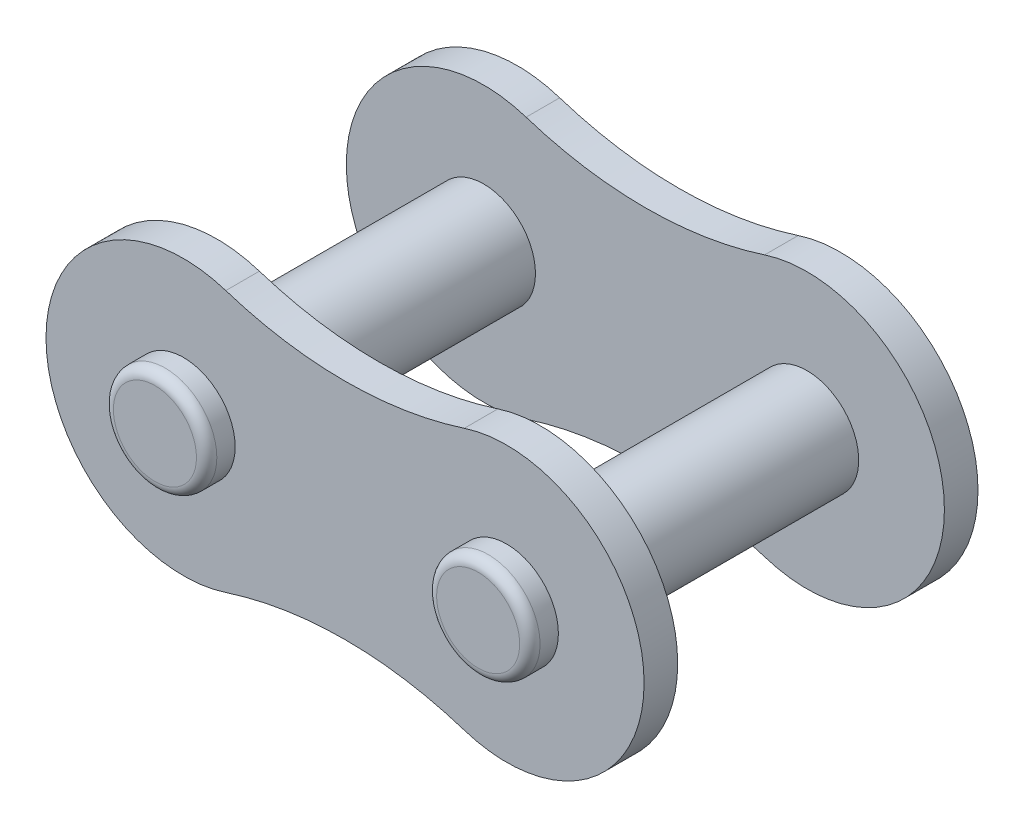
ISO-10303-21;
HEADER;
FILE_DESCRIPTION(('STEP AP214'),'2;1');
FILE_NAME('part.step','',(''),(''),'','','');
FILE_SCHEMA(('AUTOMOTIVE_DESIGN { 1 0 10303 214 1 1 1 1 }'));
ENDSEC;
DATA;
#1=APPLICATION_CONTEXT('core data for automotive mechanical design processes');
#2=APPLICATION_PROTOCOL_DEFINITION('international standard','automotive_design',2000,#1);
#3=PRODUCT_CONTEXT('',#1,'mechanical');
#4=PRODUCT('Part','Part','',(#3));
#5=PRODUCT_RELATED_PRODUCT_CATEGORY('part','',(#4));
#6=PRODUCT_DEFINITION_FORMATION('','',#4);
#7=PRODUCT_DEFINITION_CONTEXT('part definition',#1,'design');
#8=PRODUCT_DEFINITION('design','',#6,#7);
#9=PRODUCT_DEFINITION_SHAPE('','',#8);
#10=(LENGTH_UNIT() NAMED_UNIT(*) SI_UNIT(.MILLI.,.METRE.));
#11=(NAMED_UNIT(*) PLANE_ANGLE_UNIT() SI_UNIT($,.RADIAN.));
#12=(NAMED_UNIT(*) SI_UNIT($,.STERADIAN.) SOLID_ANGLE_UNIT());
#13=UNCERTAINTY_MEASURE_WITH_UNIT(LENGTH_MEASURE(1.E-05),#10,'distance_accuracy_value','');
#14=(GEOMETRIC_REPRESENTATION_CONTEXT(3) GLOBAL_UNCERTAINTY_ASSIGNED_CONTEXT((#13)) GLOBAL_UNIT_ASSIGNED_CONTEXT((#10,
#11,#12)) REPRESENTATION_CONTEXT('',''));
#15=CARTESIAN_POINT('',(0.,0.,0.));
#16=DIRECTION('',(0.,0.,1.));
#17=DIRECTION('',(1.,0.,0.));
#18=AXIS2_PLACEMENT_3D('',#15,#16,#17);
#19=CARTESIAN_POINT('',(0.,0.,-10.56));
#20=DIRECTION('',(0.,0.,-1.));
#21=DIRECTION('',(-1.,0.,0.));
#22=AXIS2_PLACEMENT_3D('',#19,#20,#21);
#23=CYLINDRICAL_SURFACE('',#22,2.54);
#24=CARTESIAN_POINT('',(0.,0.,-6.55));
#25=DIRECTION('',(0.,0.,-1.));
#26=DIRECTION('',(-1.,0.,0.));
#27=AXIS2_PLACEMENT_3D('',#24,#25,#26);
#28=CIRCLE('',#27,2.54);
#29=CARTESIAN_POINT('',(-2.54,0.,-6.55));
#30=VERTEX_POINT('',#29);
#31=EDGE_CURVE('E198',#30,#30,#28,.T.);
#32=ORIENTED_EDGE('',*,*,#31,.F.);
#33=EDGE_LOOP('',(#32));
#34=FACE_BOUND('',#33,.T.);
#35=CARTESIAN_POINT('',(0.,0.,6.55));
#36=DIRECTION('',(0.,0.,1.));
#37=DIRECTION('',(1.,0.,0.));
#38=AXIS2_PLACEMENT_3D('',#35,#36,#37);
#39=CIRCLE('',#38,2.54);
#40=CARTESIAN_POINT('',(2.54,0.,6.55));
#41=VERTEX_POINT('',#40);
#42=EDGE_CURVE('E11',#41,#41,#39,.T.);
#43=ORIENTED_EDGE('',*,*,#42,.F.);
#44=EDGE_LOOP('',(#43));
#45=FACE_BOUND('',#44,.T.);
#46=ADVANCED_FACE('F32',(#34,#45),#23,.T.);
#47=CARTESIAN_POINT('',(-15.875,0.,9.6));
#48=DIRECTION('',(0.,0.,1.));
#49=DIRECTION('',(1.,0.,0.));
#50=AXIS2_PLACEMENT_3D('',#47,#48,#49);
#51=CYLINDRICAL_SURFACE('',#50,2.54);
#52=CARTESIAN_POINT('',(-15.875,0.,-6.55));
#53=DIRECTION('',(0.,0.,-1.));
#54=DIRECTION('',(-1.,0.,0.));
#55=AXIS2_PLACEMENT_3D('',#52,#53,#54);
#56=CIRCLE('',#55,2.54);
#57=CARTESIAN_POINT('',(-18.415,0.,-6.55));
#58=VERTEX_POINT('',#57);
#59=EDGE_CURVE('E156',#58,#58,#56,.T.);
#60=ORIENTED_EDGE('',*,*,#59,.F.);
#61=EDGE_LOOP('',(#60));
#62=FACE_BOUND('',#61,.T.);
#63=CARTESIAN_POINT('',(-15.875,0.,6.55));
#64=DIRECTION('',(0.,0.,1.));
#65=DIRECTION('',(1.,0.,0.));
#66=AXIS2_PLACEMENT_3D('',#63,#64,#65);
#67=CIRCLE('',#66,2.54);
#68=CARTESIAN_POINT('',(-13.335,0.,6.55));
#69=VERTEX_POINT('',#68);
#70=EDGE_CURVE('E135',#69,#69,#67,.F.);
#71=ORIENTED_EDGE('',*,*,#70,.T.);
#72=EDGE_LOOP('',(#71));
#73=FACE_BOUND('',#72,.T.);
#74=ADVANCED_FACE('F203',(#62,#73),#51,.T.);
#75=CARTESIAN_POINT('',(0.,0.,-8.2));
#76=DIRECTION('',(0.,0.,-1.));
#77=DIRECTION('',(-1.,0.,0.));
#78=AXIS2_PLACEMENT_3D('',#75,#76,#77);
#79=CIRCLE('',#78,2.54);
#80=CARTESIAN_POINT('',(-2.54,0.,-8.2));
#81=VERTEX_POINT('',#80);
#82=EDGE_CURVE('E162',#81,#81,#79,.T.);
#83=ORIENTED_EDGE('',*,*,#82,.T.);
#84=EDGE_LOOP('',(#83));
#85=FACE_BOUND('',#84,.T.);
#86=CARTESIAN_POINT('',(0.,0.,-9.1));
#87=DIRECTION('',(0.,0.,-1.));
#88=DIRECTION('',(-1.,0.,0.));
#89=AXIS2_PLACEMENT_3D('',#86,#87,#88);
#90=CIRCLE('',#89,2.54);
#91=CARTESIAN_POINT('',(-2.54,0.,-9.1));
#92=VERTEX_POINT('',#91);
#93=EDGE_CURVE('E192',#92,#92,#90,.T.);
#94=ORIENTED_EDGE('',*,*,#93,.F.);
#95=EDGE_LOOP('',(#94));
#96=FACE_BOUND('',#95,.T.);
#97=ADVANCED_FACE('F213',(#85,#96),#23,.T.);
#98=CARTESIAN_POINT('',(0.,0.,-9.1));
#99=DIRECTION('',(0.,0.,-1.));
#100=DIRECTION('',(-1.,0.,0.));
#101=AXIS2_PLACEMENT_3D('',#98,#99,#100);
#102=TOROIDAL_SURFACE('',#101,2.04,0.500000000000001);
#103=CARTESIAN_POINT('',(0.,0.,-9.6));
#104=DIRECTION('',(0.,0.,-1.));
#105=DIRECTION('',(-1.,0.,0.));
#106=AXIS2_PLACEMENT_3D('',#103,#104,#105);
#107=CIRCLE('',#106,2.04);
#108=CARTESIAN_POINT('',(-2.04,0.,-9.6));
#109=VERTEX_POINT('',#108);
#110=EDGE_CURVE('E189',#109,#109,#107,.T.);
#111=ORIENTED_EDGE('',*,*,#110,.F.);
#112=EDGE_LOOP('',(#111));
#113=FACE_BOUND('',#112,.T.);
#114=ORIENTED_EDGE('',*,*,#93,.T.);
#115=EDGE_LOOP('',(#114));
#116=FACE_BOUND('',#115,.T.);
#117=ADVANCED_FACE('F226',(#113,#116),#102,.T.);
#118=CARTESIAN_POINT('',(0.,0.,-9.6));
#119=DIRECTION('',(0.,0.,1.));
#120=DIRECTION('',(1.,0.,0.));
#121=AXIS2_PLACEMENT_3D('',#118,#119,#120);
#122=PLANE('',#121);
#123=ORIENTED_EDGE('',*,*,#110,.T.);
#124=EDGE_LOOP('',(#123));
#125=FACE_BOUND('',#124,.T.);
#126=ADVANCED_FACE('F231',(#125),#122,.F.);
#127=CARTESIAN_POINT('',(-3.96875,-12.2480467192732,-8.2));
#128=DIRECTION('',(0.,0.,-1.));
#129=DIRECTION('',(-1.,0.,0.));
#130=AXIS2_PLACEMENT_3D('',#127,#128,#129);
#131=PLANE('',#130);
#132=ORIENTED_EDGE('',*,*,#82,.F.);
#133=EDGE_LOOP('',(#132));
#134=FACE_BOUND('',#133,.T.);
#135=CARTESIAN_POINT('',(-7.9375,-24.4960934385465,-8.2));
#136=DIRECTION('',(0.,0.,1.));
#137=DIRECTION('',(-1.,0.,0.));
#138=AXIS2_PLACEMENT_3D('',#135,#136,#137);
#139=CIRCLE('',#138,19.);
#140=CARTESIAN_POINT('',(-2.08070388349515,-6.42130604699762,-8.2));
#141=VERTEX_POINT('',#140);
#142=CARTESIAN_POINT('',(-13.7942961165049,-6.42130604699762,-8.2));
#143=VERTEX_POINT('',#142);
#144=EDGE_CURVE('E166',#141,#143,#139,.T.);
#145=ORIENTED_EDGE('',*,*,#144,.T.);
#146=CARTESIAN_POINT('',(-15.875,0.,-8.2));
#147=DIRECTION('',(0.,0.,-1.));
#148=DIRECTION('',(-1.,0.,0.));
#149=AXIS2_PLACEMENT_3D('',#146,#147,#148);
#150=CIRCLE('',#149,6.75);
#151=CARTESIAN_POINT('',(-13.7942961165049,6.42130604699762,-8.2));
#152=VERTEX_POINT('',#151);
#153=EDGE_CURVE('E82',#143,#152,#150,.T.);
#154=ORIENTED_EDGE('',*,*,#153,.T.);
#155=CARTESIAN_POINT('',(-7.9375,24.4960934385465,-8.2));
#156=DIRECTION('',(0.,0.,1.));
#157=DIRECTION('',(1.,0.,0.));
#158=AXIS2_PLACEMENT_3D('',#155,#156,#157);
#159=CIRCLE('',#158,19.);
#160=CARTESIAN_POINT('',(-2.08070388349515,6.42130604699762,-8.2));
#161=VERTEX_POINT('',#160);
#162=EDGE_CURVE('E169',#152,#161,#159,.T.);
#163=ORIENTED_EDGE('',*,*,#162,.T.);
#164=CARTESIAN_POINT('',(0.,0.,-8.2));
#165=DIRECTION('',(0.,0.,-1.));
#166=DIRECTION('',(-1.,0.,0.));
#167=AXIS2_PLACEMENT_3D('',#164,#165,#166);
#168=CIRCLE('',#167,6.75);
#169=EDGE_CURVE('E50',#161,#141,#168,.T.);
#170=ORIENTED_EDGE('',*,*,#169,.T.);
#171=EDGE_LOOP('',(#145,#154,#163,#170));
#172=FACE_BOUND('',#171,.T.);
#173=CARTESIAN_POINT('',(-15.875,0.,-8.2));
#174=DIRECTION('',(0.,0.,-1.));
#175=DIRECTION('',(-1.,0.,0.));
#176=AXIS2_PLACEMENT_3D('',#173,#174,#175);
#177=CIRCLE('',#176,2.54);
#178=CARTESIAN_POINT('',(-18.415,0.,-8.2));
#179=VERTEX_POINT('',#178);
#180=EDGE_CURVE('E159',#179,#179,#177,.T.);
#181=ORIENTED_EDGE('',*,*,#180,.F.);
#182=EDGE_LOOP('',(#181));
#183=FACE_BOUND('',#182,.T.);
#184=ADVANCED_FACE('F238',(#134,#172,#183),#131,.T.);
#185=CARTESIAN_POINT('',(-3.96875,-12.2480467192732,-6.55));
#186=DIRECTION('',(0.,0.,-1.));
#187=DIRECTION('',(-1.,0.,0.));
#188=AXIS2_PLACEMENT_3D('',#185,#186,#187);
#189=PLANE('',#188);
#190=CARTESIAN_POINT('',(-7.9375,-24.4960934385465,-6.55));
#191=DIRECTION('',(0.,0.,1.));
#192=DIRECTION('',(-1.,0.,0.));
#193=AXIS2_PLACEMENT_3D('',#190,#191,#192);
#194=CIRCLE('',#193,19.);
#195=CARTESIAN_POINT('',(-2.08070388349515,-6.42130604699762,-6.55));
#196=VERTEX_POINT('',#195);
#197=CARTESIAN_POINT('',(-13.7942961165049,-6.42130604699762,-6.55));
#198=VERTEX_POINT('',#197);
#199=EDGE_CURVE('E165',#196,#198,#194,.T.);
#200=ORIENTED_EDGE('',*,*,#199,.F.);
#201=CARTESIAN_POINT('',(0.,0.,-6.55));
#202=DIRECTION('',(0.,0.,-1.));
#203=DIRECTION('',(-1.,0.,0.));
#204=AXIS2_PLACEMENT_3D('',#201,#202,#203);
#205=CIRCLE('',#204,6.75);
#206=CARTESIAN_POINT('',(-2.08070388349515,6.42130604699762,-6.55));
#207=VERTEX_POINT('',#206);
#208=EDGE_CURVE('E74',#207,#196,#205,.T.);
#209=ORIENTED_EDGE('',*,*,#208,.F.);
#210=CARTESIAN_POINT('',(-7.9375,24.4960934385465,-6.55));
#211=DIRECTION('',(0.,0.,1.));
#212=DIRECTION('',(1.,0.,0.));
#213=AXIS2_PLACEMENT_3D('',#210,#211,#212);
#214=CIRCLE('',#213,19.);
#215=CARTESIAN_POINT('',(-13.7942961165049,6.42130604699762,-6.55));
#216=VERTEX_POINT('',#215);
#217=EDGE_CURVE('E68',#216,#207,#214,.T.);
#218=ORIENTED_EDGE('',*,*,#217,.F.);
#219=CARTESIAN_POINT('',(-15.875,0.,-6.55));
#220=DIRECTION('',(0.,0.,-1.));
#221=DIRECTION('',(-1.,0.,0.));
#222=AXIS2_PLACEMENT_3D('',#219,#220,#221);
#223=CIRCLE('',#222,6.75);
#224=EDGE_CURVE('E175',#198,#216,#223,.T.);
#225=ORIENTED_EDGE('',*,*,#224,.F.);
#226=EDGE_LOOP('',(#200,#209,#218,#225));
#227=FACE_BOUND('',#226,.T.);
#228=ORIENTED_EDGE('',*,*,#31,.T.);
#229=EDGE_LOOP('',(#228));
#230=FACE_BOUND('',#229,.T.);
#231=ORIENTED_EDGE('',*,*,#59,.T.);
#232=EDGE_LOOP('',(#231));
#233=FACE_BOUND('',#232,.T.);
#234=ADVANCED_FACE('F240',(#227,#230,#233),#189,.F.);
#235=CARTESIAN_POINT('',(-7.9375,-24.4960934385465,-8.2));
#236=DIRECTION('',(0.,0.,1.));
#237=DIRECTION('',(1.,0.,0.));
#238=AXIS2_PLACEMENT_3D('',#235,#236,#237);
#239=CYLINDRICAL_SURFACE('',#238,19.);
#240=ORIENTED_EDGE('',*,*,#199,.T.);
#241=DIRECTION('',(0.,0.,1.));
#242=VECTOR('',#241,1.);
#243=CARTESIAN_POINT('',(-13.7942961165049,-6.42130604699762,-8.2));
#244=LINE('',#243,#242);
#245=EDGE_CURVE('E184',#143,#198,#244,.T.);
#246=ORIENTED_EDGE('',*,*,#245,.F.);
#247=ORIENTED_EDGE('',*,*,#144,.F.);
#248=DIRECTION('',(0.,0.,1.));
#249=VECTOR('',#248,1.);
#250=CARTESIAN_POINT('',(-2.08070388349515,-6.42130604699762,-8.2));
#251=LINE('',#250,#249);
#252=EDGE_CURVE('E172',#141,#196,#251,.T.);
#253=ORIENTED_EDGE('',*,*,#252,.T.);
#254=EDGE_LOOP('',(#240,#246,#247,#253));
#255=FACE_BOUND('',#254,.T.);
#256=ADVANCED_FACE('F274',(#255),#239,.F.);
#257=CARTESIAN_POINT('',(-15.875,0.,-8.2));
#258=DIRECTION('',(0.,0.,1.));
#259=DIRECTION('',(1.,0.,0.));
#260=AXIS2_PLACEMENT_3D('',#257,#258,#259);
#261=CYLINDRICAL_SURFACE('',#260,6.75);
#262=ORIENTED_EDGE('',*,*,#224,.T.);
#263=DIRECTION('',(0.,0.,1.));
#264=VECTOR('',#263,1.);
#265=CARTESIAN_POINT('',(-13.7942961165049,6.42130604699762,-8.2));
#266=LINE('',#265,#264);
#267=EDGE_CURVE('E182',#152,#216,#266,.T.);
#268=ORIENTED_EDGE('',*,*,#267,.F.);
#269=ORIENTED_EDGE('',*,*,#153,.F.);
#270=ORIENTED_EDGE('',*,*,#245,.T.);
#271=EDGE_LOOP('',(#262,#268,#269,#270));
#272=FACE_BOUND('',#271,.T.);
#273=ADVANCED_FACE('F281',(#272),#261,.T.);
#274=CARTESIAN_POINT('',(-7.9375,24.4960934385465,-8.2));
#275=DIRECTION('',(0.,0.,1.));
#276=DIRECTION('',(1.,0.,0.));
#277=AXIS2_PLACEMENT_3D('',#274,#275,#276);
#278=CYLINDRICAL_SURFACE('',#277,19.);
#279=ORIENTED_EDGE('',*,*,#217,.T.);
#280=DIRECTION('',(0.,0.,1.));
#281=VECTOR('',#280,1.);
#282=CARTESIAN_POINT('',(-2.08070388349515,6.42130604699762,-8.2));
#283=LINE('',#282,#281);
#284=EDGE_CURVE('E180',#161,#207,#283,.T.);
#285=ORIENTED_EDGE('',*,*,#284,.F.);
#286=ORIENTED_EDGE('',*,*,#162,.F.);
#287=ORIENTED_EDGE('',*,*,#267,.T.);
#288=EDGE_LOOP('',(#279,#285,#286,#287));
#289=FACE_BOUND('',#288,.T.);
#290=ADVANCED_FACE('F278',(#289),#278,.F.);
#291=CARTESIAN_POINT('',(0.,0.,-8.2));
#292=DIRECTION('',(0.,0.,1.));
#293=DIRECTION('',(1.,0.,0.));
#294=AXIS2_PLACEMENT_3D('',#291,#292,#293);
#295=CYLINDRICAL_SURFACE('',#294,6.75);
#296=ORIENTED_EDGE('',*,*,#208,.T.);
#297=ORIENTED_EDGE('',*,*,#252,.F.);
#298=ORIENTED_EDGE('',*,*,#169,.F.);
#299=ORIENTED_EDGE('',*,*,#284,.T.);
#300=EDGE_LOOP('',(#296,#297,#298,#299));
#301=FACE_BOUND('',#300,.T.);
#302=ADVANCED_FACE('F259',(#301),#295,.T.);
#303=CARTESIAN_POINT('',(-17.915,0.,-9.6));
#304=DIRECTION('',(0.,0.,-1.));
#305=DIRECTION('',(-1.,0.,0.));
#306=AXIS2_PLACEMENT_3D('',#303,#304,#305);
#307=PLANE('',#306);
#308=CARTESIAN_POINT('',(-15.875,0.,-9.6));
#309=DIRECTION('',(0.,0.,1.));
#310=DIRECTION('',(1.,0.,0.));
#311=AXIS2_PLACEMENT_3D('',#308,#309,#310);
#312=CIRCLE('',#311,2.04);
#313=CARTESIAN_POINT('',(-13.835,0.,-9.6));
#314=VERTEX_POINT('',#313);
#315=EDGE_CURVE('E150',#314,#314,#312,.T.);
#316=ORIENTED_EDGE('',*,*,#315,.F.);
#317=EDGE_LOOP('',(#316));
#318=FACE_BOUND('',#317,.T.);
#319=ADVANCED_FACE('F253',(#318),#307,.T.);
#320=CARTESIAN_POINT('',(-15.875,0.,-9.1));
#321=DIRECTION('',(0.,0.,1.));
#322=DIRECTION('',(1.,0.,0.));
#323=AXIS2_PLACEMENT_3D('',#320,#321,#322);
#324=TOROIDAL_SURFACE('',#323,2.04,0.500000000000002);
#325=ORIENTED_EDGE('',*,*,#315,.T.);
#326=EDGE_LOOP('',(#325));
#327=FACE_BOUND('',#326,.T.);
#328=CARTESIAN_POINT('',(-15.875,0.,-9.1));
#329=DIRECTION('',(0.,0.,1.));
#330=DIRECTION('',(1.,0.,0.));
#331=AXIS2_PLACEMENT_3D('',#328,#329,#330);
#332=CIRCLE('',#331,2.54);
#333=CARTESIAN_POINT('',(-13.335,0.,-9.1));
#334=VERTEX_POINT('',#333);
#335=EDGE_CURVE('E147',#334,#334,#332,.T.);
#336=ORIENTED_EDGE('',*,*,#335,.F.);
#337=EDGE_LOOP('',(#336));
#338=FACE_BOUND('',#337,.T.);
#339=ADVANCED_FACE('F249',(#327,#338),#324,.T.);
#340=ORIENTED_EDGE('',*,*,#180,.T.);
#341=EDGE_LOOP('',(#340));
#342=FACE_BOUND('',#341,.T.);
#343=ORIENTED_EDGE('',*,*,#335,.T.);
#344=EDGE_LOOP('',(#343));
#345=FACE_BOUND('',#344,.T.);
#346=ADVANCED_FACE('F220',(#342,#345),#51,.T.);
#347=CARTESIAN_POINT('',(-3.96875,-12.2480467192732,8.2));
#348=DIRECTION('',(0.,0.,1.));
#349=DIRECTION('',(-1.,0.,0.));
#350=AXIS2_PLACEMENT_3D('',#347,#348,#349);
#351=PLANE('',#350);
#352=CARTESIAN_POINT('',(-15.875,0.,8.2));
#353=DIRECTION('',(0.,0.,1.));
#354=DIRECTION('',(1.,0.,0.));
#355=AXIS2_PLACEMENT_3D('',#352,#353,#354);
#356=CIRCLE('',#355,2.54);
#357=CARTESIAN_POINT('',(-13.335,0.,8.2));
#358=VERTEX_POINT('',#357);
#359=EDGE_CURVE('E36',#358,#358,#356,.F.);
#360=ORIENTED_EDGE('',*,*,#359,.T.);
#361=EDGE_LOOP('',(#360));
#362=FACE_BOUND('',#361,.T.);
#363=CARTESIAN_POINT('',(-7.9375,-24.4960934385465,8.2));
#364=DIRECTION('',(0.,0.,1.));
#365=DIRECTION('',(-1.,0.,0.));
#366=AXIS2_PLACEMENT_3D('',#363,#364,#365);
#367=CIRCLE('',#366,19.);
#368=CARTESIAN_POINT('',(-2.08070388349515,-6.42130604699762,8.2));
#369=VERTEX_POINT('',#368);
#370=CARTESIAN_POINT('',(-13.7942961165049,-6.42130604699762,8.2));
#371=VERTEX_POINT('',#370);
#372=EDGE_CURVE('E133',#369,#371,#367,.T.);
#373=ORIENTED_EDGE('',*,*,#372,.F.);
#374=CARTESIAN_POINT('',(0.,0.,8.2));
#375=DIRECTION('',(0.,0.,-1.));
#376=DIRECTION('',(-1.,0.,0.));
#377=AXIS2_PLACEMENT_3D('',#374,#375,#376);
#378=CIRCLE('',#377,6.75);
#379=CARTESIAN_POINT('',(-2.08070388349515,6.42130604699762,8.2));
#380=VERTEX_POINT('',#379);
#381=EDGE_CURVE('E115',#380,#369,#378,.T.);
#382=ORIENTED_EDGE('',*,*,#381,.F.);
#383=CARTESIAN_POINT('',(-7.9375,24.4960934385465,8.2));
#384=DIRECTION('',(0.,0.,1.));
#385=DIRECTION('',(1.,0.,0.));
#386=AXIS2_PLACEMENT_3D('',#383,#384,#385);
#387=CIRCLE('',#386,19.);
#388=CARTESIAN_POINT('',(-13.7942961165049,6.42130604699762,8.2));
#389=VERTEX_POINT('',#388);
#390=EDGE_CURVE('E467',#389,#380,#387,.T.);
#391=ORIENTED_EDGE('',*,*,#390,.F.);
#392=CARTESIAN_POINT('',(-15.875,0.,8.2));
#393=DIRECTION('',(0.,0.,-1.));
#394=DIRECTION('',(-1.,0.,0.));
#395=AXIS2_PLACEMENT_3D('',#392,#393,#394);
#396=CIRCLE('',#395,6.75);
#397=EDGE_CURVE('E137',#371,#389,#396,.T.);
#398=ORIENTED_EDGE('',*,*,#397,.F.);
#399=EDGE_LOOP('',(#373,#382,#391,#398));
#400=FACE_BOUND('',#399,.T.);
#401=CARTESIAN_POINT('',(0.,0.,8.2));
#402=DIRECTION('',(0.,0.,1.));
#403=DIRECTION('',(1.,0.,0.));
#404=AXIS2_PLACEMENT_3D('',#401,#402,#403);
#405=CIRCLE('',#404,2.54);
#406=CARTESIAN_POINT('',(2.54,0.,8.2));
#407=VERTEX_POINT('',#406);
#408=EDGE_CURVE('E141',#407,#407,#405,.T.);
#409=ORIENTED_EDGE('',*,*,#408,.F.);
#410=EDGE_LOOP('',(#409));
#411=FACE_BOUND('',#410,.T.);
#412=ADVANCED_FACE('F206',(#362,#400,#411),#351,.T.);
#413=CARTESIAN_POINT('',(-3.96875,-12.2480467192732,6.55));
#414=DIRECTION('',(0.,0.,1.));
#415=DIRECTION('',(-1.,0.,0.));
#416=AXIS2_PLACEMENT_3D('',#413,#414,#415);
#417=PLANE('',#416);
#418=CARTESIAN_POINT('',(-7.9375,-24.4960934385465,6.55));
#419=DIRECTION('',(0.,0.,1.));
#420=DIRECTION('',(-1.,0.,0.));
#421=AXIS2_PLACEMENT_3D('',#418,#419,#420);
#422=CIRCLE('',#421,19.);
#423=CARTESIAN_POINT('',(-2.08070388349515,-6.42130604699762,6.55));
#424=VERTEX_POINT('',#423);
#425=CARTESIAN_POINT('',(-13.7942961165049,-6.42130604699762,6.55));
#426=VERTEX_POINT('',#425);
#427=EDGE_CURVE('E126',#424,#426,#422,.T.);
#428=ORIENTED_EDGE('',*,*,#427,.T.);
#429=CARTESIAN_POINT('',(-15.875,0.,6.55));
#430=DIRECTION('',(0.,0.,-1.));
#431=DIRECTION('',(-1.,0.,0.));
#432=AXIS2_PLACEMENT_3D('',#429,#430,#431);
#433=CIRCLE('',#432,6.75);
#434=CARTESIAN_POINT('',(-13.7942961165049,6.42130604699762,6.55));
#435=VERTEX_POINT('',#434);
#436=EDGE_CURVE('E468',#426,#435,#433,.T.);
#437=ORIENTED_EDGE('',*,*,#436,.T.);
#438=CARTESIAN_POINT('',(-7.9375,24.4960934385465,6.55));
#439=DIRECTION('',(0.,0.,1.));
#440=DIRECTION('',(1.,0.,0.));
#441=AXIS2_PLACEMENT_3D('',#438,#439,#440);
#442=CIRCLE('',#441,19.);
#443=CARTESIAN_POINT('',(-2.08070388349515,6.42130604699762,6.55));
#444=VERTEX_POINT('',#443);
#445=EDGE_CURVE('E128',#435,#444,#442,.T.);
#446=ORIENTED_EDGE('',*,*,#445,.T.);
#447=CARTESIAN_POINT('',(0.,0.,6.55));
#448=DIRECTION('',(0.,0.,-1.));
#449=DIRECTION('',(-1.,0.,0.));
#450=AXIS2_PLACEMENT_3D('',#447,#448,#449);
#451=CIRCLE('',#450,6.75);
#452=EDGE_CURVE('E112',#444,#424,#451,.T.);
#453=ORIENTED_EDGE('',*,*,#452,.T.);
#454=EDGE_LOOP('',(#428,#437,#446,#453));
#455=FACE_BOUND('',#454,.T.);
#456=ORIENTED_EDGE('',*,*,#70,.F.);
#457=EDGE_LOOP('',(#456));
#458=FACE_BOUND('',#457,.T.);
#459=ORIENTED_EDGE('',*,*,#42,.T.);
#460=EDGE_LOOP('',(#459));
#461=FACE_BOUND('',#460,.T.);
#462=ADVANCED_FACE('F123',(#455,#458,#461),#417,.F.);
#463=CARTESIAN_POINT('',(-7.9375,-24.4960934385465,8.2));
#464=DIRECTION('',(0.,0.,-1.));
#465=DIRECTION('',(1.,0.,0.));
#466=AXIS2_PLACEMENT_3D('',#463,#464,#465);
#467=CYLINDRICAL_SURFACE('',#466,19.);
#468=ORIENTED_EDGE('',*,*,#427,.F.);
#469=DIRECTION('',(0.,0.,-1.));
#470=VECTOR('',#469,1.);
#471=CARTESIAN_POINT('',(-2.08070388349515,-6.42130604699762,8.2));
#472=LINE('',#471,#470);
#473=EDGE_CURVE('E109',#369,#424,#472,.T.);
#474=ORIENTED_EDGE('',*,*,#473,.F.);
#475=ORIENTED_EDGE('',*,*,#372,.T.);
#476=DIRECTION('',(0.,0.,-1.));
#477=VECTOR('',#476,1.);
#478=CARTESIAN_POINT('',(-13.7942961165049,-6.42130604699762,8.2));
#479=LINE('',#478,#477);
#480=EDGE_CURVE('E131',#371,#426,#479,.T.);
#481=ORIENTED_EDGE('',*,*,#480,.T.);
#482=EDGE_LOOP('',(#468,#474,#475,#481));
#483=FACE_BOUND('',#482,.T.);
#484=ADVANCED_FACE('F130',(#483),#467,.F.);
#485=CARTESIAN_POINT('',(-15.875,0.,8.2));
#486=DIRECTION('',(0.,0.,-1.));
#487=DIRECTION('',(1.,0.,0.));
#488=AXIS2_PLACEMENT_3D('',#485,#486,#487);
#489=CYLINDRICAL_SURFACE('',#488,6.75);
#490=ORIENTED_EDGE('',*,*,#436,.F.);
#491=ORIENTED_EDGE('',*,*,#480,.F.);
#492=ORIENTED_EDGE('',*,*,#397,.T.);
#493=DIRECTION('',(0.,0.,-1.));
#494=VECTOR('',#493,1.);
#495=CARTESIAN_POINT('',(-13.7942961165049,6.42130604699762,8.2));
#496=LINE('',#495,#494);
#497=EDGE_CURVE('E469',#389,#435,#496,.T.);
#498=ORIENTED_EDGE('',*,*,#497,.T.);
#499=EDGE_LOOP('',(#490,#491,#492,#498));
#500=FACE_BOUND('',#499,.T.);
#501=ADVANCED_FACE('F375',(#500),#489,.T.);
#502=CARTESIAN_POINT('',(-7.9375,24.4960934385465,8.2));
#503=DIRECTION('',(0.,0.,-1.));
#504=DIRECTION('',(1.,0.,0.));
#505=AXIS2_PLACEMENT_3D('',#502,#503,#504);
#506=CYLINDRICAL_SURFACE('',#505,19.);
#507=ORIENTED_EDGE('',*,*,#445,.F.);
#508=ORIENTED_EDGE('',*,*,#497,.F.);
#509=ORIENTED_EDGE('',*,*,#390,.T.);
#510=DIRECTION('',(0.,0.,-1.));
#511=VECTOR('',#510,1.);
#512=CARTESIAN_POINT('',(-2.08070388349515,6.42130604699762,8.2));
#513=LINE('',#512,#511);
#514=EDGE_CURVE('E475',#380,#444,#513,.T.);
#515=ORIENTED_EDGE('',*,*,#514,.T.);
#516=EDGE_LOOP('',(#507,#508,#509,#515));
#517=FACE_BOUND('',#516,.T.);
#518=ADVANCED_FACE('F384',(#517),#506,.F.);
#519=CARTESIAN_POINT('',(0.,0.,8.2));
#520=DIRECTION('',(0.,0.,-1.));
#521=DIRECTION('',(1.,0.,0.));
#522=AXIS2_PLACEMENT_3D('',#519,#520,#521);
#523=CYLINDRICAL_SURFACE('',#522,6.75);
#524=ORIENTED_EDGE('',*,*,#452,.F.);
#525=ORIENTED_EDGE('',*,*,#514,.F.);
#526=ORIENTED_EDGE('',*,*,#381,.T.);
#527=ORIENTED_EDGE('',*,*,#473,.T.);
#528=EDGE_LOOP('',(#524,#525,#526,#527));
#529=FACE_BOUND('',#528,.T.);
#530=ADVANCED_FACE('F111',(#529),#523,.T.);
#531=CARTESIAN_POINT('',(-15.875,0.,9.6));
#532=DIRECTION('',(0.,0.,1.));
#533=DIRECTION('',(1.,0.,0.));
#534=AXIS2_PLACEMENT_3D('',#531,#532,#533);
#535=PLANE('',#534);
#536=CARTESIAN_POINT('',(-15.875,0.,9.6));
#537=DIRECTION('',(0.,0.,1.));
#538=DIRECTION('',(1.,0.,0.));
#539=AXIS2_PLACEMENT_3D('',#536,#537,#538);
#540=CIRCLE('',#539,2.04);
#541=CARTESIAN_POINT('',(-13.835,0.,9.6));
#542=VERTEX_POINT('',#541);
#543=EDGE_CURVE('E153',#542,#542,#540,.T.);
#544=ORIENTED_EDGE('',*,*,#543,.T.);
#545=EDGE_LOOP('',(#544));
#546=FACE_BOUND('',#545,.T.);
#547=ADVANCED_FACE('F264',(#546),#535,.T.);
#548=CARTESIAN_POINT('',(-15.875,0.,9.1));
#549=DIRECTION('',(0.,0.,1.));
#550=DIRECTION('',(1.,0.,0.));
#551=AXIS2_PLACEMENT_3D('',#548,#549,#550);
#552=TOROIDAL_SURFACE('',#551,2.04,0.5);
#553=CARTESIAN_POINT('',(-15.875,0.,9.1));
#554=DIRECTION('',(0.,0.,1.));
#555=DIRECTION('',(1.,0.,0.));
#556=AXIS2_PLACEMENT_3D('',#553,#554,#555);
#557=CIRCLE('',#556,2.54);
#558=CARTESIAN_POINT('',(-13.335,0.,9.1));
#559=VERTEX_POINT('',#558);
#560=EDGE_CURVE('E144',#559,#559,#557,.T.);
#561=ORIENTED_EDGE('',*,*,#560,.T.);
#562=EDGE_LOOP('',(#561));
#563=FACE_BOUND('',#562,.T.);
#564=ORIENTED_EDGE('',*,*,#543,.F.);
#565=EDGE_LOOP('',(#564));
#566=FACE_BOUND('',#565,.T.);
#567=ADVANCED_FACE('F267',(#563,#566),#552,.T.);
#568=ORIENTED_EDGE('',*,*,#359,.F.);
#569=EDGE_LOOP('',(#568));
#570=FACE_BOUND('',#569,.T.);
#571=ORIENTED_EDGE('',*,*,#560,.F.);
#572=EDGE_LOOP('',(#571));
#573=FACE_BOUND('',#572,.T.);
#574=ADVANCED_FACE('F219',(#570,#573),#51,.T.);
#575=CARTESIAN_POINT('',(2.04,0.,9.6));
#576=DIRECTION('',(0.,0.,-1.));
#577=DIRECTION('',(-1.,0.,0.));
#578=AXIS2_PLACEMENT_3D('',#575,#576,#577);
#579=PLANE('',#578);
#580=CARTESIAN_POINT('',(0.,0.,9.6));
#581=DIRECTION('',(0.,0.,-1.));
#582=DIRECTION('',(-1.,0.,0.));
#583=AXIS2_PLACEMENT_3D('',#580,#581,#582);
#584=CIRCLE('',#583,2.04);
#585=CARTESIAN_POINT('',(-2.04,0.,9.6));
#586=VERTEX_POINT('',#585);
#587=EDGE_CURVE('E186',#586,#586,#584,.T.);
#588=ORIENTED_EDGE('',*,*,#587,.F.);
#589=EDGE_LOOP('',(#588));
#590=FACE_BOUND('',#589,.T.);
#591=ADVANCED_FACE('F287',(#590),#579,.F.);
#592=CARTESIAN_POINT('',(0.,0.,9.1));
#593=DIRECTION('',(0.,0.,-1.));
#594=DIRECTION('',(-1.,0.,0.));
#595=AXIS2_PLACEMENT_3D('',#592,#593,#594);
#596=TOROIDAL_SURFACE('',#595,2.04,0.5);
#597=CARTESIAN_POINT('',(0.,0.,9.1));
#598=DIRECTION('',(0.,0.,-1.));
#599=DIRECTION('',(-1.,0.,0.));
#600=AXIS2_PLACEMENT_3D('',#597,#598,#599);
#601=CIRCLE('',#600,2.54);
#602=CARTESIAN_POINT('',(-2.54,0.,9.1));
#603=VERTEX_POINT('',#602);
#604=EDGE_CURVE('E195',#603,#603,#601,.T.);
#605=ORIENTED_EDGE('',*,*,#604,.F.);
#606=EDGE_LOOP('',(#605));
#607=FACE_BOUND('',#606,.T.);
#608=ORIENTED_EDGE('',*,*,#587,.T.);
#609=EDGE_LOOP('',(#608));
#610=FACE_BOUND('',#609,.T.);
#611=ADVANCED_FACE('F34',(#607,#610),#596,.T.);
#612=ORIENTED_EDGE('',*,*,#408,.T.);
#613=EDGE_LOOP('',(#612));
#614=FACE_BOUND('',#613,.T.);
#615=ORIENTED_EDGE('',*,*,#604,.T.);
#616=EDGE_LOOP('',(#615));
#617=FACE_BOUND('',#616,.T.);
#618=ADVANCED_FACE('F212',(#614,#617),#23,.T.);
#619=CLOSED_SHELL('',(#46,#74,#97,#117,#126,#184,#234,#256,#273,#290,#302,#319,#339,#346,#412,
#462,#484,#501,#518,#530,#547,#567,#574,#591,#611,#618));
#620=MANIFOLD_SOLID_BREP('B2',#619);
#621=ADVANCED_BREP_SHAPE_REPRESENTATION('',(#18,#620),#14);
#622=SHAPE_DEFINITION_REPRESENTATION(#9,#621);
ENDSEC;
END-ISO-10303-21;
